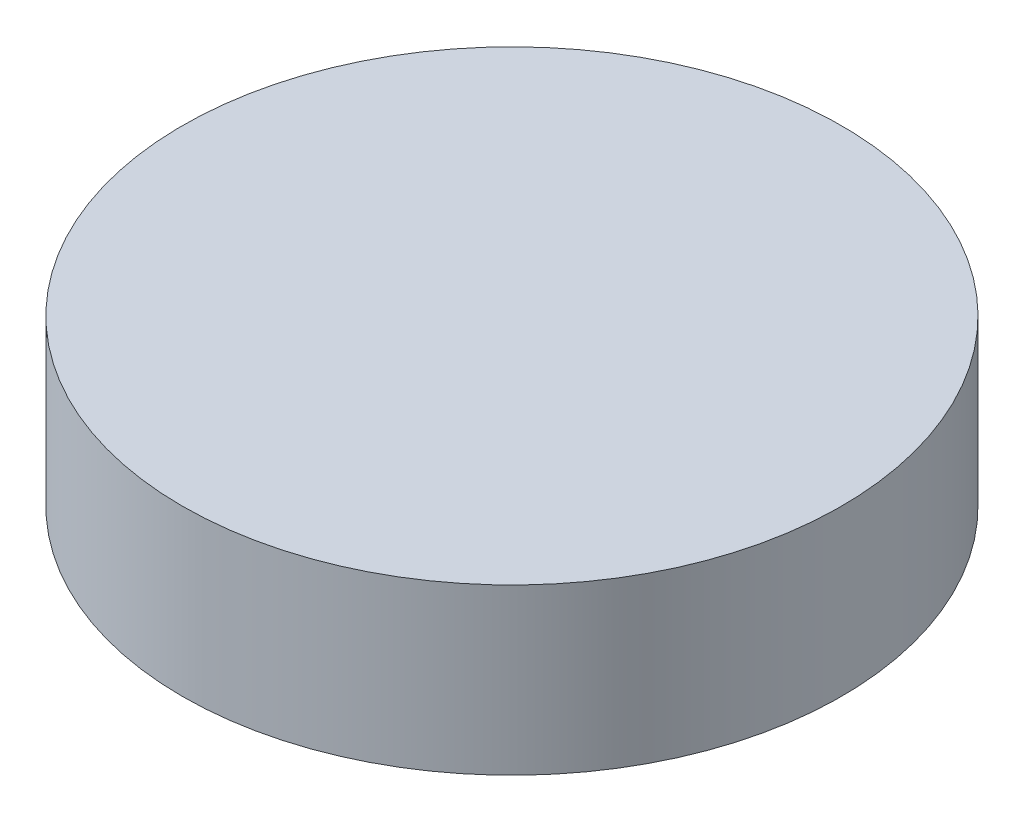
ISO-10303-21;
HEADER;
FILE_DESCRIPTION(('STEP AP214'),'2;1');
FILE_NAME('part.step','',(''),(''),'','','');
FILE_SCHEMA(('AUTOMOTIVE_DESIGN { 1 0 10303 214 1 1 1 1 }'));
ENDSEC;
DATA;
#1=APPLICATION_CONTEXT('core data for automotive mechanical design processes');
#2=APPLICATION_PROTOCOL_DEFINITION('international standard','automotive_design',2000,#1);
#3=PRODUCT_CONTEXT('',#1,'mechanical');
#4=PRODUCT('Part','Part','',(#3));
#5=PRODUCT_RELATED_PRODUCT_CATEGORY('part','',(#4));
#6=PRODUCT_DEFINITION_FORMATION('','',#4);
#7=PRODUCT_DEFINITION_CONTEXT('part definition',#1,'design');
#8=PRODUCT_DEFINITION('design','',#6,#7);
#9=PRODUCT_DEFINITION_SHAPE('','',#8);
#10=(LENGTH_UNIT() NAMED_UNIT(*) SI_UNIT(.MILLI.,.METRE.));
#11=(NAMED_UNIT(*) PLANE_ANGLE_UNIT() SI_UNIT($,.RADIAN.));
#12=(NAMED_UNIT(*) SI_UNIT($,.STERADIAN.) SOLID_ANGLE_UNIT());
#13=UNCERTAINTY_MEASURE_WITH_UNIT(LENGTH_MEASURE(1.E-05),#10,'distance_accuracy_value','');
#14=(GEOMETRIC_REPRESENTATION_CONTEXT(3) GLOBAL_UNCERTAINTY_ASSIGNED_CONTEXT((#13)) GLOBAL_UNIT_ASSIGNED_CONTEXT((#10,
#11,#12)) REPRESENTATION_CONTEXT('',''));
#15=CARTESIAN_POINT('',(0.,0.,0.));
#16=DIRECTION('',(0.,0.,1.));
#17=DIRECTION('',(1.,0.,0.));
#18=AXIS2_PLACEMENT_3D('',#15,#16,#17);
#19=CARTESIAN_POINT('',(-2.04113657313688,1.,-0.184966702735177));
#20=DIRECTION('',(0.,-1.,0.));
#21=DIRECTION('',(0.,0.,-1.));
#22=AXIS2_PLACEMENT_3D('',#19,#20,#21);
#23=CYLINDRICAL_SURFACE('',#22,2.);
#24=CARTESIAN_POINT('',(-2.04113657313688,1.,-0.184966702735177));
#25=DIRECTION('',(0.,1.,0.));
#26=DIRECTION('',(0.,0.,1.));
#27=AXIS2_PLACEMENT_3D('',#24,#25,#26);
#28=CIRCLE('',#27,2.);
#29=CARTESIAN_POINT('',(-2.04113657313688,1.,1.81503329726482));
#30=VERTEX_POINT('',#29);
#31=EDGE_CURVE('E10',#30,#30,#28,.T.);
#32=ORIENTED_EDGE('',*,*,#31,.F.);
#33=EDGE_LOOP('',(#32));
#34=FACE_BOUND('',#33,.T.);
#35=CARTESIAN_POINT('',(-2.04113657313688,0.,-0.184966702735177));
#36=DIRECTION('',(0.,1.,0.));
#37=DIRECTION('',(0.,0.,1.));
#38=AXIS2_PLACEMENT_3D('',#35,#36,#37);
#39=CIRCLE('',#38,2.);
#40=CARTESIAN_POINT('',(-2.04113657313688,0.,1.81503329726482));
#41=VERTEX_POINT('',#40);
#42=EDGE_CURVE('E35',#41,#41,#39,.T.);
#43=ORIENTED_EDGE('',*,*,#42,.T.);
#44=EDGE_LOOP('',(#43));
#45=FACE_BOUND('',#44,.T.);
#46=ADVANCED_FACE('F32',(#34,#45),#23,.T.);
#47=CARTESIAN_POINT('',(-2.04113657313688,1.,-0.184966702735177));
#48=DIRECTION('',(0.,1.,0.));
#49=DIRECTION('',(0.,0.,1.));
#50=AXIS2_PLACEMENT_3D('',#47,#48,#49);
#51=PLANE('',#50);
#52=ORIENTED_EDGE('',*,*,#31,.T.);
#53=EDGE_LOOP('',(#52));
#54=FACE_BOUND('',#53,.T.);
#55=ADVANCED_FACE('F47',(#54),#51,.T.);
#56=CARTESIAN_POINT('',(-2.04113657313688,0.,-0.184966702735177));
#57=DIRECTION('',(0.,1.,0.));
#58=DIRECTION('',(0.,0.,1.));
#59=AXIS2_PLACEMENT_3D('',#56,#57,#58);
#60=PLANE('',#59);
#61=ORIENTED_EDGE('',*,*,#42,.F.);
#62=EDGE_LOOP('',(#61));
#63=FACE_BOUND('',#62,.T.);
#64=ADVANCED_FACE('F45',(#63),#60,.F.);
#65=CLOSED_SHELL('',(#46,#55,#64));
#66=MANIFOLD_SOLID_BREP('B2',#65);
#67=ADVANCED_BREP_SHAPE_REPRESENTATION('',(#18,#66),#14);
#68=SHAPE_DEFINITION_REPRESENTATION(#9,#67);
ENDSEC;
END-ISO-10303-21;
